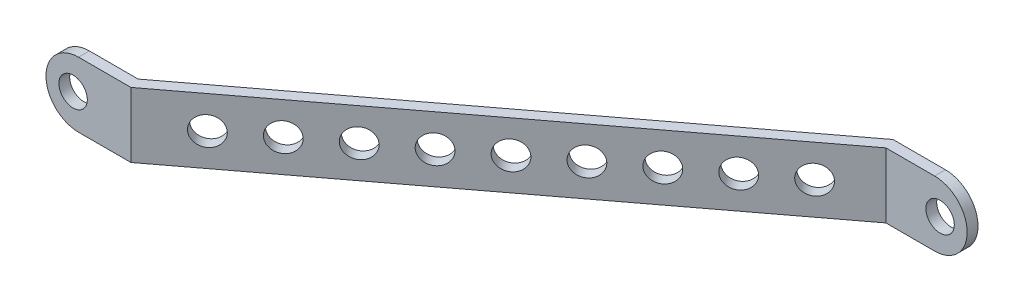
ISO-10303-21;
HEADER;
FILE_DESCRIPTION(('STEP AP214'),'2;1');
FILE_NAME('part.step','',(''),(''),'','','');
FILE_SCHEMA(('AUTOMOTIVE_DESIGN { 1 0 10303 214 1 1 1 1 }'));
ENDSEC;
DATA;
#1=APPLICATION_CONTEXT('core data for automotive mechanical design processes');
#2=APPLICATION_PROTOCOL_DEFINITION('international standard','automotive_design',2000,#1);
#3=PRODUCT_CONTEXT('',#1,'mechanical');
#4=PRODUCT('Part','Part','',(#3));
#5=PRODUCT_RELATED_PRODUCT_CATEGORY('part','',(#4));
#6=PRODUCT_DEFINITION_FORMATION('','',#4);
#7=PRODUCT_DEFINITION_CONTEXT('part definition',#1,'design');
#8=PRODUCT_DEFINITION('design','',#6,#7);
#9=PRODUCT_DEFINITION_SHAPE('','',#8);
#10=(LENGTH_UNIT() NAMED_UNIT(*) SI_UNIT(.MILLI.,.METRE.));
#11=(NAMED_UNIT(*) PLANE_ANGLE_UNIT() SI_UNIT($,.RADIAN.));
#12=(NAMED_UNIT(*) SI_UNIT($,.STERADIAN.) SOLID_ANGLE_UNIT());
#13=UNCERTAINTY_MEASURE_WITH_UNIT(LENGTH_MEASURE(1.E-05),#10,'distance_accuracy_value','');
#14=(GEOMETRIC_REPRESENTATION_CONTEXT(3) GLOBAL_UNCERTAINTY_ASSIGNED_CONTEXT((#13)) GLOBAL_UNIT_ASSIGNED_CONTEXT((#10,
#11,#12)) REPRESENTATION_CONTEXT('',''));
#15=CARTESIAN_POINT('',(0.,0.,0.));
#16=DIRECTION('',(0.,0.,1.));
#17=DIRECTION('',(1.,0.,0.));
#18=AXIS2_PLACEMENT_3D('',#15,#16,#17);
#19=CARTESIAN_POINT('',(-81.4365246825822,4.8,17.4471175497052));
#20=DIRECTION('',(0.,0.,-1.));
#21=DIRECTION('',(-1.,0.,0.));
#22=AXIS2_PLACEMENT_3D('',#19,#20,#21);
#23=CYLINDRICAL_SURFACE('',#22,4.8);
#24=CARTESIAN_POINT('',(-81.4365246825822,4.8,15.8471175497052));
#25=DIRECTION('',(0.,0.,-1.));
#26=DIRECTION('',(-1.,0.,0.));
#27=AXIS2_PLACEMENT_3D('',#24,#25,#26);
#28=CIRCLE('',#27,4.8);
#29=CARTESIAN_POINT('',(-81.4365246825822,9.6,15.8471175497052));
#30=VERTEX_POINT('',#29);
#31=CARTESIAN_POINT('',(-81.4365246825822,0.,15.8471175497052));
#32=VERTEX_POINT('',#31);
#33=EDGE_CURVE('E20',#30,#32,#28,.F.);
#34=ORIENTED_EDGE('',*,*,#33,.T.);
#35=DIRECTION('',(0.,0.,-1.));
#36=VECTOR('',#35,1.);
#37=CARTESIAN_POINT('',(-81.4365246825822,0.,15.8471175497052));
#38=LINE('',#37,#36);
#39=CARTESIAN_POINT('',(-81.4365246825822,0.,17.4471175497052));
#40=VERTEX_POINT('',#39);
#41=EDGE_CURVE('E112',#40,#32,#38,.T.);
#42=ORIENTED_EDGE('',*,*,#41,.F.);
#43=CARTESIAN_POINT('',(-81.4365246825822,4.8,17.4471175497052));
#44=DIRECTION('',(0.,0.,-1.));
#45=DIRECTION('',(-1.,0.,0.));
#46=AXIS2_PLACEMENT_3D('',#43,#44,#45);
#47=CIRCLE('',#46,4.8);
#48=CARTESIAN_POINT('',(-81.4365246825822,9.6,17.4471175497052));
#49=VERTEX_POINT('',#48);
#50=EDGE_CURVE('E84',#40,#49,#47,.T.);
#51=ORIENTED_EDGE('',*,*,#50,.T.);
#52=DIRECTION('',(0.,0.,-1.));
#53=VECTOR('',#52,1.);
#54=CARTESIAN_POINT('',(-81.4365246825822,9.6,17.4471175497052));
#55=LINE('',#54,#53);
#56=EDGE_CURVE('E80',#49,#30,#55,.T.);
#57=ORIENTED_EDGE('',*,*,#56,.T.);
#58=EDGE_LOOP('',(#34,#42,#51,#57));
#59=FACE_BOUND('',#58,.T.);
#60=ADVANCED_FACE('F17',(#59),#23,.T.);
#61=CARTESIAN_POINT('',(-82.2365246825822,4.8,7.84711754970517));
#62=DIRECTION('',(0.,0.,1.));
#63=DIRECTION('',(1.,0.,0.));
#64=AXIS2_PLACEMENT_3D('',#61,#62,#63);
#65=CYLINDRICAL_SURFACE('',#64,2.1);
#66=CARTESIAN_POINT('',(-82.2365246825822,4.8,15.8471175497052));
#67=DIRECTION('',(0.,0.,1.));
#68=DIRECTION('',(1.,0.,0.));
#69=AXIS2_PLACEMENT_3D('',#66,#67,#68);
#70=CIRCLE('',#69,2.1);
#71=CARTESIAN_POINT('',(-80.1365246825822,4.8,15.8471175497052));
#72=VERTEX_POINT('',#71);
#73=EDGE_CURVE('E96',#72,#72,#70,.F.);
#74=ORIENTED_EDGE('',*,*,#73,.T.);
#75=EDGE_LOOP('',(#74));
#76=FACE_BOUND('',#75,.T.);
#77=CARTESIAN_POINT('',(-82.2365246825822,4.8,17.4471175497052));
#78=DIRECTION('',(0.,0.,1.));
#79=DIRECTION('',(1.,0.,0.));
#80=AXIS2_PLACEMENT_3D('',#77,#78,#79);
#81=CIRCLE('',#80,2.1);
#82=CARTESIAN_POINT('',(-80.1365246825822,4.8,17.4471175497052));
#83=VERTEX_POINT('',#82);
#84=EDGE_CURVE('E102',#83,#83,#81,.T.);
#85=ORIENTED_EDGE('',*,*,#84,.T.);
#86=EDGE_LOOP('',(#85));
#87=FACE_BOUND('',#86,.T.);
#88=ADVANCED_FACE('F189',(#76,#87),#65,.F.);
#89=CARTESIAN_POINT('',(-86.2365246825823,9.6,15.8471175497052));
#90=DIRECTION('',(0.,0.,1.));
#91=DIRECTION('',(1.,0.,0.));
#92=AXIS2_PLACEMENT_3D('',#89,#90,#91);
#93=PLANE('',#92);
#94=ORIENTED_EDGE('',*,*,#73,.F.);
#95=EDGE_LOOP('',(#94));
#96=FACE_BOUND('',#95,.T.);
#97=DIRECTION('',(1.,0.,0.));
#98=VECTOR('',#97,1.);
#99=CARTESIAN_POINT('',(-86.2365246825823,9.6,15.8471175497052));
#100=LINE('',#99,#98);
#101=CARTESIAN_POINT('',(-74.2365246825822,9.6,15.8471175497052));
#102=VERTEX_POINT('',#101);
#103=EDGE_CURVE('E94',#30,#102,#100,.T.);
#104=ORIENTED_EDGE('',*,*,#103,.T.);
#105=DIRECTION('',(0.,1.,0.));
#106=VECTOR('',#105,1.);
#107=CARTESIAN_POINT('',(-74.2365246825822,9.6,15.8471175497052));
#108=LINE('',#107,#106);
#109=CARTESIAN_POINT('',(-74.2365246825822,0.,15.8471175497052));
#110=VERTEX_POINT('',#109);
#111=EDGE_CURVE('E110',#102,#110,#108,.F.);
#112=ORIENTED_EDGE('',*,*,#111,.T.);
#113=DIRECTION('',(1.,0.,0.));
#114=VECTOR('',#113,1.);
#115=CARTESIAN_POINT('',(-86.2365246825823,0.,15.8471175497052));
#116=LINE('',#115,#114);
#117=EDGE_CURVE('E95',#32,#110,#116,.T.);
#118=ORIENTED_EDGE('',*,*,#117,.F.);
#119=ORIENTED_EDGE('',*,*,#33,.F.);
#120=EDGE_LOOP('',(#104,#112,#118,#119));
#121=FACE_BOUND('',#120,.T.);
#122=ADVANCED_FACE('F92',(#96,#121),#93,.F.);
#123=CARTESIAN_POINT('',(-10.7734593192059,9.6,-32.1528824502948));
#124=DIRECTION('',(0.,0.,1.));
#125=DIRECTION('',(1.,0.,0.));
#126=AXIS2_PLACEMENT_3D('',#123,#124,#125);
#127=PLANE('',#126);
#128=CARTESIAN_POINT('',(-2.23652468258224,4.8,-32.1528824502948));
#129=DIRECTION('',(0.,0.,1.));
#130=DIRECTION('',(1.,0.,0.));
#131=AXIS2_PLACEMENT_3D('',#128,#129,#130);
#132=CIRCLE('',#131,2.1);
#133=CARTESIAN_POINT('',(-0.136524682582242,4.8,-32.1528824502948));
#134=VERTEX_POINT('',#133);
#135=EDGE_CURVE('E181',#134,#134,#132,.T.);
#136=ORIENTED_EDGE('',*,*,#135,.T.);
#137=EDGE_LOOP('',(#136));
#138=FACE_BOUND('',#137,.T.);
#139=DIRECTION('',(1.,0.,0.));
#140=VECTOR('',#139,1.);
#141=CARTESIAN_POINT('',(-86.2365246825823,0.,-32.1528824502948));
#142=LINE('',#141,#140);
#143=CARTESIAN_POINT('',(-10.7734593192059,0.,-32.1528824502948));
#144=VERTEX_POINT('',#143);
#145=CARTESIAN_POINT('',(-3.03652468258224,0.,-32.1528824502948));
#146=VERTEX_POINT('',#145);
#147=EDGE_CURVE('E115',#144,#146,#142,.T.);
#148=ORIENTED_EDGE('',*,*,#147,.F.);
#149=DIRECTION('',(0.,1.,0.));
#150=VECTOR('',#149,1.);
#151=CARTESIAN_POINT('',(-10.7734593192059,9.6,-32.1528824502948));
#152=LINE('',#151,#150);
#153=CARTESIAN_POINT('',(-10.7734593192059,9.6,-32.1528824502948));
#154=VERTEX_POINT('',#153);
#155=EDGE_CURVE('E184',#144,#154,#152,.T.);
#156=ORIENTED_EDGE('',*,*,#155,.T.);
#157=DIRECTION('',(1.,0.,0.));
#158=VECTOR('',#157,1.);
#159=CARTESIAN_POINT('',(-86.2365246825823,9.6,-32.1528824502948));
#160=LINE('',#159,#158);
#161=CARTESIAN_POINT('',(-3.03652468258224,9.6,-32.1528824502948));
#162=VERTEX_POINT('',#161);
#163=EDGE_CURVE('E104',#154,#162,#160,.T.);
#164=ORIENTED_EDGE('',*,*,#163,.T.);
#165=CARTESIAN_POINT('',(-3.03652468258223,4.8,-32.1528824502948));
#166=DIRECTION('',(0.,0.,-1.));
#167=DIRECTION('',(-1.,0.,0.));
#168=AXIS2_PLACEMENT_3D('',#165,#166,#167);
#169=CIRCLE('',#168,4.8);
#170=EDGE_CURVE('E185',#146,#162,#169,.F.);
#171=ORIENTED_EDGE('',*,*,#170,.F.);
#172=EDGE_LOOP('',(#148,#156,#164,#171));
#173=FACE_BOUND('',#172,.T.);
#174=ADVANCED_FACE('F193',(#138,#173),#127,.F.);
#175=CARTESIAN_POINT('',(-3.03652468258216,4.8,15.847117549705));
#176=DIRECTION('',(0.,0.,-1.));
#177=DIRECTION('',(-1.,0.,0.));
#178=AXIS2_PLACEMENT_3D('',#175,#176,#177);
#179=CYLINDRICAL_SURFACE('',#178,4.8);
#180=DIRECTION('',(0.,0.,-1.));
#181=VECTOR('',#180,1.);
#182=CARTESIAN_POINT('',(-3.03652468258224,0.,15.8471175497052));
#183=LINE('',#182,#181);
#184=CARTESIAN_POINT('',(-3.03652468258224,0.,-30.5528824502948));
#185=VERTEX_POINT('',#184);
#186=EDGE_CURVE('E117',#146,#185,#183,.F.);
#187=ORIENTED_EDGE('',*,*,#186,.F.);
#188=ORIENTED_EDGE('',*,*,#170,.T.);
#189=DIRECTION('',(0.,0.,-1.));
#190=VECTOR('',#189,1.);
#191=CARTESIAN_POINT('',(-3.03652468258224,9.6,15.8471175497052));
#192=LINE('',#191,#190);
#193=CARTESIAN_POINT('',(-3.03652468258224,9.6,-30.5528824502948));
#194=VERTEX_POINT('',#193);
#195=EDGE_CURVE('E292',#162,#194,#192,.F.);
#196=ORIENTED_EDGE('',*,*,#195,.T.);
#197=CARTESIAN_POINT('',(-3.03652468258223,4.8,-30.5528824502948));
#198=DIRECTION('',(0.,0.,-1.));
#199=DIRECTION('',(-1.,0.,0.));
#200=AXIS2_PLACEMENT_3D('',#197,#198,#199);
#201=CIRCLE('',#200,4.8);
#202=EDGE_CURVE('E168',#194,#185,#201,.T.);
#203=ORIENTED_EDGE('',*,*,#202,.T.);
#204=EDGE_LOOP('',(#187,#188,#196,#203));
#205=FACE_BOUND('',#204,.T.);
#206=ADVANCED_FACE('F200',(#205),#179,.T.);
#207=CARTESIAN_POINT('',(-2.23652468258224,4.8,-40.1528824502948));
#208=DIRECTION('',(0.,0.,1.));
#209=DIRECTION('',(1.,0.,0.));
#210=AXIS2_PLACEMENT_3D('',#207,#208,#209);
#211=CYLINDRICAL_SURFACE('',#210,2.1);
#212=ORIENTED_EDGE('',*,*,#135,.F.);
#213=EDGE_LOOP('',(#212));
#214=FACE_BOUND('',#213,.T.);
#215=CARTESIAN_POINT('',(-2.23652468258224,4.8,-30.5528824502948));
#216=DIRECTION('',(0.,0.,1.));
#217=DIRECTION('',(1.,0.,0.));
#218=AXIS2_PLACEMENT_3D('',#215,#216,#217);
#219=CIRCLE('',#218,2.1);
#220=CARTESIAN_POINT('',(-0.136524682582242,4.8,-30.5528824502948));
#221=VERTEX_POINT('',#220);
#222=EDGE_CURVE('E165',#221,#221,#219,.T.);
#223=ORIENTED_EDGE('',*,*,#222,.T.);
#224=EDGE_LOOP('',(#223));
#225=FACE_BOUND('',#224,.T.);
#226=ADVANCED_FACE('F265',(#214,#225),#211,.F.);
#227=CARTESIAN_POINT('',(-74.2365246825822,9.6,15.8471175497052));
#228=DIRECTION('',(0.603234054930972,0.,0.797564213697892));
#229=DIRECTION('',(0.797564213697892,0.,-0.603234054930972));
#230=AXIS2_PLACEMENT_3D('',#227,#228,#229);
#231=PLANE('',#230);
#232=CARTESIAN_POINT('',(-68.2363969714431,4.8,11.3089483250449));
#233=DIRECTION('',(0.603234054930972,0.,0.797564213697892));
#234=DIRECTION('',(0.797564213697892,0.,-0.603234054930972));
#235=AXIS2_PLACEMENT_3D('',#232,#233,#234);
#236=CIRCLE('',#235,2.1);
#237=CARTESIAN_POINT('',(-66.5615121226776,4.8,10.0421568096899));
#238=VERTEX_POINT('',#237);
#239=EDGE_CURVE('E147',#238,#238,#236,.T.);
#240=ORIENTED_EDGE('',*,*,#239,.T.);
#241=EDGE_LOOP('',(#240));
#242=FACE_BOUND('',#241,.T.);
#243=CARTESIAN_POINT('',(-61.85588326186,4.8,6.48307588559712));
#244=DIRECTION('',(0.603234054930972,0.,0.797564213697892));
#245=DIRECTION('',(0.797564213697892,0.,-0.603234054930972));
#246=AXIS2_PLACEMENT_3D('',#243,#244,#245);
#247=CIRCLE('',#246,2.1);
#248=CARTESIAN_POINT('',(-60.1809984130944,4.8,5.21628437024208));
#249=VERTEX_POINT('',#248);
#250=EDGE_CURVE('E150',#249,#249,#247,.T.);
#251=ORIENTED_EDGE('',*,*,#250,.T.);
#252=EDGE_LOOP('',(#251));
#253=FACE_BOUND('',#252,.T.);
#254=CARTESIAN_POINT('',(-55.4753695522769,4.8,1.65720344614935));
#255=DIRECTION('',(0.603234054930972,0.,0.797564213697892));
#256=DIRECTION('',(0.797564213697892,0.,-0.603234054930972));
#257=AXIS2_PLACEMENT_3D('',#254,#255,#256);
#258=CIRCLE('',#257,2.1);
#259=CARTESIAN_POINT('',(-53.8004847035113,4.8,0.390411930794314));
#260=VERTEX_POINT('',#259);
#261=EDGE_CURVE('E153',#260,#260,#258,.T.);
#262=ORIENTED_EDGE('',*,*,#261,.T.);
#263=EDGE_LOOP('',(#262));
#264=FACE_BOUND('',#263,.T.);
#265=CARTESIAN_POINT('',(-49.0948558426937,4.8,-3.16866899329842));
#266=DIRECTION('',(0.603234054930972,0.,0.797564213697892));
#267=DIRECTION('',(0.797564213697892,0.,-0.603234054930972));
#268=AXIS2_PLACEMENT_3D('',#265,#266,#267);
#269=CIRCLE('',#268,2.1);
#270=CARTESIAN_POINT('',(-47.4199709939281,4.8,-4.43546050865347));
#271=VERTEX_POINT('',#270);
#272=EDGE_CURVE('E156',#271,#271,#269,.T.);
#273=ORIENTED_EDGE('',*,*,#272,.T.);
#274=EDGE_LOOP('',(#273));
#275=FACE_BOUND('',#274,.T.);
#276=CARTESIAN_POINT('',(-36.3338284235274,4.8,-12.820413872194));
#277=DIRECTION('',(0.603234054930972,0.,0.797564213697892));
#278=DIRECTION('',(0.797564213697892,0.,-0.603234054930972));
#279=AXIS2_PLACEMENT_3D('',#276,#277,#278);
#280=CIRCLE('',#279,2.1);
#281=CARTESIAN_POINT('',(-34.6589435747619,4.8,-14.087205387549));
#282=VERTEX_POINT('',#281);
#283=EDGE_CURVE('E159',#282,#282,#280,.T.);
#284=ORIENTED_EDGE('',*,*,#283,.T.);
#285=EDGE_LOOP('',(#284));
#286=FACE_BOUND('',#285,.T.);
#287=CARTESIAN_POINT('',(-42.7143421331106,4.8,-7.9945414327462));
#288=DIRECTION('',(0.603234054930972,0.,0.797564213697892));
#289=DIRECTION('',(0.797564213697892,0.,-0.603234054930972));
#290=AXIS2_PLACEMENT_3D('',#287,#288,#289);
#291=CIRCLE('',#290,2.1);
#292=CARTESIAN_POINT('',(-41.039457284345,4.8,-9.26133294810124));
#293=VERTEX_POINT('',#292);
#294=EDGE_CURVE('E162',#293,#293,#291,.T.);
#295=ORIENTED_EDGE('',*,*,#294,.T.);
#296=EDGE_LOOP('',(#295));
#297=FACE_BOUND('',#296,.T.);
#298=DIRECTION('',(0.797564213697892,0.,-0.603234054930972));
#299=VECTOR('',#298,1.);
#300=CARTESIAN_POINT('',(-74.2365246825822,9.6,15.8471175497052));
#301=LINE('',#300,#299);
#302=EDGE_CURVE('E101',#102,#154,#301,.T.);
#303=ORIENTED_EDGE('',*,*,#302,.T.);
#304=ORIENTED_EDGE('',*,*,#155,.F.);
#305=DIRECTION('',(0.797564213697892,0.,-0.603234054930972));
#306=VECTOR('',#305,1.);
#307=CARTESIAN_POINT('',(-74.2365246825822,0.,15.8471175497052));
#308=LINE('',#307,#306);
#309=EDGE_CURVE('E118',#110,#144,#308,.T.);
#310=ORIENTED_EDGE('',*,*,#309,.F.);
#311=ORIENTED_EDGE('',*,*,#111,.F.);
#312=EDGE_LOOP('',(#303,#304,#310,#311));
#313=FACE_BOUND('',#312,.T.);
#314=CARTESIAN_POINT('',(-29.9533147139443,4.8,-17.6462863116417));
#315=DIRECTION('',(0.603234054930972,0.,0.797564213697892));
#316=DIRECTION('',(0.797564213697892,0.,-0.603234054930972));
#317=AXIS2_PLACEMENT_3D('',#314,#315,#316);
#318=CIRCLE('',#317,2.1);
#319=CARTESIAN_POINT('',(-28.2784298651787,4.8,-18.9130778269968));
#320=VERTEX_POINT('',#319);
#321=EDGE_CURVE('E113',#320,#320,#318,.T.);
#322=ORIENTED_EDGE('',*,*,#321,.T.);
#323=EDGE_LOOP('',(#322));
#324=FACE_BOUND('',#323,.T.);
#325=CARTESIAN_POINT('',(-23.5728010043612,4.8,-22.4721587510895));
#326=DIRECTION('',(0.603234054930972,0.,0.797564213697892));
#327=DIRECTION('',(0.797564213697892,0.,-0.603234054930972));
#328=AXIS2_PLACEMENT_3D('',#325,#326,#327);
#329=CIRCLE('',#328,2.1);
#330=CARTESIAN_POINT('',(-21.8979161555956,4.8,-23.7389502664446));
#331=VERTEX_POINT('',#330);
#332=EDGE_CURVE('E175',#331,#331,#329,.T.);
#333=ORIENTED_EDGE('',*,*,#332,.T.);
#334=EDGE_LOOP('',(#333));
#335=FACE_BOUND('',#334,.T.);
#336=CARTESIAN_POINT('',(-17.192287294778,4.8,-27.2980311905373));
#337=DIRECTION('',(0.603234054930972,0.,0.797564213697892));
#338=DIRECTION('',(0.797564213697892,0.,-0.603234054930972));
#339=AXIS2_PLACEMENT_3D('',#336,#337,#338);
#340=CIRCLE('',#339,2.1);
#341=CARTESIAN_POINT('',(-15.5174024460124,4.8,-28.5648227058923));
#342=VERTEX_POINT('',#341);
#343=EDGE_CURVE('E178',#342,#342,#340,.T.);
#344=ORIENTED_EDGE('',*,*,#343,.T.);
#345=EDGE_LOOP('',(#344));
#346=FACE_BOUND('',#345,.T.);
#347=ADVANCED_FACE('F261',(#242,#253,#264,#275,#286,#297,#313,#324,#335,#346),#231,.F.);
#348=CARTESIAN_POINT('',(-22.0181597342258,4.8,-33.6785449001204));
#349=DIRECTION('',(0.603234054930972,0.,0.797564213697892));
#350=DIRECTION('',(0.797564213697892,0.,-0.603234054930972));
#351=AXIS2_PLACEMENT_3D('',#348,#349,#350);
#352=CYLINDRICAL_SURFACE('',#351,2.1);
#353=CARTESIAN_POINT('',(-16.2271128068885,4.8,-26.0219284486207));
#354=DIRECTION('',(0.603234054930972,0.,0.797564213697892));
#355=DIRECTION('',(0.797564213697892,0.,-0.603234054930972));
#356=AXIS2_PLACEMENT_3D('',#353,#354,#355);
#357=CIRCLE('',#356,2.1);
#358=CARTESIAN_POINT('',(-14.5522279581229,4.8,-27.2887199639757));
#359=VERTEX_POINT('',#358);
#360=EDGE_CURVE('E144',#359,#359,#357,.T.);
#361=ORIENTED_EDGE('',*,*,#360,.T.);
#362=EDGE_LOOP('',(#361));
#363=FACE_BOUND('',#362,.T.);
#364=ORIENTED_EDGE('',*,*,#343,.F.);
#365=EDGE_LOOP('',(#364));
#366=FACE_BOUND('',#365,.T.);
#367=ADVANCED_FACE('F257',(#363,#366),#352,.F.);
#368=CARTESIAN_POINT('',(-28.3986734438089,4.8,-28.8526724606727));
#369=DIRECTION('',(0.603234054930972,0.,0.797564213697892));
#370=DIRECTION('',(0.797564213697892,0.,-0.603234054930972));
#371=AXIS2_PLACEMENT_3D('',#368,#369,#370);
#372=CYLINDRICAL_SURFACE('',#371,2.1);
#373=CARTESIAN_POINT('',(-22.6076265164716,4.8,-21.1960560091729));
#374=DIRECTION('',(0.603234054930972,0.,0.797564213697892));
#375=DIRECTION('',(0.797564213697892,0.,-0.603234054930972));
#376=AXIS2_PLACEMENT_3D('',#373,#374,#375);
#377=CIRCLE('',#376,2.1);
#378=CARTESIAN_POINT('',(-20.932741667706,4.8,-22.4628475245279));
#379=VERTEX_POINT('',#378);
#380=EDGE_CURVE('E141',#379,#379,#377,.T.);
#381=ORIENTED_EDGE('',*,*,#380,.T.);
#382=EDGE_LOOP('',(#381));
#383=FACE_BOUND('',#382,.T.);
#384=ORIENTED_EDGE('',*,*,#332,.F.);
#385=EDGE_LOOP('',(#384));
#386=FACE_BOUND('',#385,.T.);
#387=ADVANCED_FACE('F253',(#383,#386),#372,.F.);
#388=CARTESIAN_POINT('',(-34.7791871533921,4.8,-24.0268000212249));
#389=DIRECTION('',(0.603234054930972,0.,0.797564213697892));
#390=DIRECTION('',(0.797564213697892,0.,-0.603234054930972));
#391=AXIS2_PLACEMENT_3D('',#388,#389,#390);
#392=CYLINDRICAL_SURFACE('',#391,2.1);
#393=CARTESIAN_POINT('',(-28.9881402260547,4.8,-16.3701835697251));
#394=DIRECTION('',(0.603234054930972,0.,0.797564213697892));
#395=DIRECTION('',(0.797564213697892,0.,-0.603234054930972));
#396=AXIS2_PLACEMENT_3D('',#393,#394,#395);
#397=CIRCLE('',#396,2.1);
#398=CARTESIAN_POINT('',(-27.3132553772892,4.8,-17.6369750850802));
#399=VERTEX_POINT('',#398);
#400=EDGE_CURVE('E137',#399,#399,#397,.T.);
#401=ORIENTED_EDGE('',*,*,#400,.T.);
#402=EDGE_LOOP('',(#401));
#403=FACE_BOUND('',#402,.T.);
#404=ORIENTED_EDGE('',*,*,#321,.F.);
#405=EDGE_LOOP('',(#404));
#406=FACE_BOUND('',#405,.T.);
#407=ADVANCED_FACE('F249',(#403,#406),#392,.F.);
#408=CARTESIAN_POINT('',(-86.2365246825823,0.,15.8471175497052));
#409=DIRECTION('',(0.,-1.,0.));
#410=DIRECTION('',(0.,0.,-1.));
#411=AXIS2_PLACEMENT_3D('',#408,#409,#410);
#412=PLANE('',#411);
#413=ORIENTED_EDGE('',*,*,#147,.T.);
#414=ORIENTED_EDGE('',*,*,#186,.T.);
#415=DIRECTION('',(-1.,0.,0.));
#416=VECTOR('',#415,1.);
#417=CARTESIAN_POINT('',(1.76347531741776,0.,-30.5528824502948));
#418=LINE('',#417,#416);
#419=CARTESIAN_POINT('',(-10.2365246825822,0.,-30.5528824502948));
#420=VERTEX_POINT('',#419);
#421=EDGE_CURVE('E291',#185,#420,#418,.T.);
#422=ORIENTED_EDGE('',*,*,#421,.T.);
#423=DIRECTION('',(-0.797564213697892,0.,0.603234054930972));
#424=VECTOR('',#423,1.);
#425=CARTESIAN_POINT('',(-10.2365246825822,0.,-30.5528824502948));
#426=LINE('',#425,#424);
#427=CARTESIAN_POINT('',(-73.6995900459586,0.,17.4471175497052));
#428=VERTEX_POINT('',#427);
#429=EDGE_CURVE('E140',#420,#428,#426,.T.);
#430=ORIENTED_EDGE('',*,*,#429,.T.);
#431=DIRECTION('',(-1.,0.,0.));
#432=VECTOR('',#431,1.);
#433=CARTESIAN_POINT('',(-73.6995900459586,0.,17.4471175497052));
#434=LINE('',#433,#432);
#435=EDGE_CURVE('E172',#428,#40,#434,.T.);
#436=ORIENTED_EDGE('',*,*,#435,.T.);
#437=ORIENTED_EDGE('',*,*,#41,.T.);
#438=ORIENTED_EDGE('',*,*,#117,.T.);
#439=ORIENTED_EDGE('',*,*,#309,.T.);
#440=EDGE_LOOP('',(#413,#414,#422,#430,#436,#437,#438,#439));
#441=FACE_BOUND('',#440,.T.);
#442=ADVANCED_FACE('F245',(#441),#412,.T.);
#443=CARTESIAN_POINT('',(-73.6995900459586,9.6,17.4471175497052));
#444=DIRECTION('',(0.,0.,-1.));
#445=DIRECTION('',(-1.,0.,0.));
#446=AXIS2_PLACEMENT_3D('',#443,#444,#445);
#447=PLANE('',#446);
#448=ORIENTED_EDGE('',*,*,#84,.F.);
#449=EDGE_LOOP('',(#448));
#450=FACE_BOUND('',#449,.T.);
#451=ORIENTED_EDGE('',*,*,#435,.F.);
#452=DIRECTION('',(0.,1.,0.));
#453=VECTOR('',#452,1.);
#454=CARTESIAN_POINT('',(-73.6995900459586,9.6,17.4471175497052));
#455=LINE('',#454,#453);
#456=CARTESIAN_POINT('',(-73.6995900459586,9.6,17.4471175497052));
#457=VERTEX_POINT('',#456);
#458=EDGE_CURVE('E288',#428,#457,#455,.T.);
#459=ORIENTED_EDGE('',*,*,#458,.T.);
#460=DIRECTION('',(1.,0.,0.));
#461=VECTOR('',#460,1.);
#462=CARTESIAN_POINT('',(-86.2365246825823,9.6,17.4471175497052));
#463=LINE('',#462,#461);
#464=EDGE_CURVE('E289',#457,#49,#463,.F.);
#465=ORIENTED_EDGE('',*,*,#464,.T.);
#466=ORIENTED_EDGE('',*,*,#50,.F.);
#467=EDGE_LOOP('',(#451,#459,#465,#466));
#468=FACE_BOUND('',#467,.T.);
#469=ADVANCED_FACE('F242',(#450,#468),#447,.F.);
#470=CARTESIAN_POINT('',(-86.2365246825823,9.6,15.8471175497052));
#471=DIRECTION('',(0.,-1.,0.));
#472=DIRECTION('',(0.,0.,-1.));
#473=AXIS2_PLACEMENT_3D('',#470,#471,#472);
#474=PLANE('',#473);
#475=ORIENTED_EDGE('',*,*,#464,.F.);
#476=DIRECTION('',(-0.797564213697892,0.,0.603234054930972));
#477=VECTOR('',#476,1.);
#478=CARTESIAN_POINT('',(-10.2365246825822,9.6,-30.5528824502948));
#479=LINE('',#478,#477);
#480=CARTESIAN_POINT('',(-10.2365246825822,9.6,-30.5528824502948));
#481=VERTEX_POINT('',#480);
#482=EDGE_CURVE('E284',#457,#481,#479,.F.);
#483=ORIENTED_EDGE('',*,*,#482,.T.);
#484=DIRECTION('',(-1.,0.,0.));
#485=VECTOR('',#484,1.);
#486=CARTESIAN_POINT('',(1.76347531741776,9.6,-30.5528824502948));
#487=LINE('',#486,#485);
#488=EDGE_CURVE('E35',#481,#194,#487,.F.);
#489=ORIENTED_EDGE('',*,*,#488,.T.);
#490=ORIENTED_EDGE('',*,*,#195,.F.);
#491=ORIENTED_EDGE('',*,*,#163,.F.);
#492=ORIENTED_EDGE('',*,*,#302,.F.);
#493=ORIENTED_EDGE('',*,*,#103,.F.);
#494=ORIENTED_EDGE('',*,*,#56,.F.);
#495=EDGE_LOOP('',(#475,#483,#489,#490,#491,#492,#493,#494));
#496=FACE_BOUND('',#495,.T.);
#497=ADVANCED_FACE('F98',(#496),#474,.F.);
#498=CARTESIAN_POINT('',(1.76347531741776,9.6,-30.5528824502948));
#499=DIRECTION('',(0.,0.,-1.));
#500=DIRECTION('',(-1.,0.,0.));
#501=AXIS2_PLACEMENT_3D('',#498,#499,#500);
#502=PLANE('',#501);
#503=ORIENTED_EDGE('',*,*,#222,.F.);
#504=EDGE_LOOP('',(#503));
#505=FACE_BOUND('',#504,.T.);
#506=ORIENTED_EDGE('',*,*,#488,.F.);
#507=DIRECTION('',(0.,1.,0.));
#508=VECTOR('',#507,1.);
#509=CARTESIAN_POINT('',(-10.2365246825822,9.6,-30.5528824502948));
#510=LINE('',#509,#508);
#511=EDGE_CURVE('E136',#481,#420,#510,.F.);
#512=ORIENTED_EDGE('',*,*,#511,.T.);
#513=ORIENTED_EDGE('',*,*,#421,.F.);
#514=ORIENTED_EDGE('',*,*,#202,.F.);
#515=EDGE_LOOP('',(#506,#512,#513,#514));
#516=FACE_BOUND('',#515,.T.);
#517=ADVANCED_FACE('F235',(#505,#516),#502,.F.);
#518=CARTESIAN_POINT('',(-47.5402145725584,4.8,-14.3750551423293));
#519=DIRECTION('',(0.603234054930972,0.,0.797564213697892));
#520=DIRECTION('',(0.797564213697892,0.,-0.603234054930972));
#521=AXIS2_PLACEMENT_3D('',#518,#519,#520);
#522=CYLINDRICAL_SURFACE('',#521,2.1);
#523=CARTESIAN_POINT('',(-41.749167645221,4.8,-6.71843869082956));
#524=DIRECTION('',(0.603234054930972,0.,0.797564213697892));
#525=DIRECTION('',(0.797564213697892,0.,-0.603234054930972));
#526=AXIS2_PLACEMENT_3D('',#523,#524,#525);
#527=CIRCLE('',#526,2.1);
#528=CARTESIAN_POINT('',(-40.0742827964555,4.8,-7.9852302061846));
#529=VERTEX_POINT('',#528);
#530=EDGE_CURVE('E133',#529,#529,#527,.T.);
#531=ORIENTED_EDGE('',*,*,#530,.T.);
#532=EDGE_LOOP('',(#531));
#533=FACE_BOUND('',#532,.T.);
#534=ORIENTED_EDGE('',*,*,#294,.F.);
#535=EDGE_LOOP('',(#534));
#536=FACE_BOUND('',#535,.T.);
#537=ADVANCED_FACE('F231',(#533,#536),#522,.F.);
#538=CARTESIAN_POINT('',(-41.1597008629752,4.8,-19.2009275817771));
#539=DIRECTION('',(0.603234054930972,0.,0.797564213697892));
#540=DIRECTION('',(0.797564213697892,0.,-0.603234054930972));
#541=AXIS2_PLACEMENT_3D('',#538,#539,#540);
#542=CYLINDRICAL_SURFACE('',#541,2.1);
#543=CARTESIAN_POINT('',(-35.3686539356379,4.8,-11.5443111302773));
#544=DIRECTION('',(0.603234054930972,0.,0.797564213697892));
#545=DIRECTION('',(0.797564213697892,0.,-0.603234054930972));
#546=AXIS2_PLACEMENT_3D('',#543,#544,#545);
#547=CIRCLE('',#546,2.1);
#548=CARTESIAN_POINT('',(-33.6937690868723,4.8,-12.8111026456324));
#549=VERTEX_POINT('',#548);
#550=EDGE_CURVE('E130',#549,#549,#547,.T.);
#551=ORIENTED_EDGE('',*,*,#550,.T.);
#552=EDGE_LOOP('',(#551));
#553=FACE_BOUND('',#552,.T.);
#554=ORIENTED_EDGE('',*,*,#283,.F.);
#555=EDGE_LOOP('',(#554));
#556=FACE_BOUND('',#555,.T.);
#557=ADVANCED_FACE('F227',(#553,#556),#542,.F.);
#558=CARTESIAN_POINT('',(-53.9207282821415,4.8,-9.54918270288156));
#559=DIRECTION('',(0.603234054930972,0.,0.797564213697892));
#560=DIRECTION('',(0.797564213697892,0.,-0.603234054930972));
#561=AXIS2_PLACEMENT_3D('',#558,#559,#560);
#562=CYLINDRICAL_SURFACE('',#561,2.1);
#563=CARTESIAN_POINT('',(-48.1296813548041,4.8,-1.89256625138179));
#564=DIRECTION('',(0.603234054930972,0.,0.797564213697892));
#565=DIRECTION('',(0.797564213697892,0.,-0.603234054930972));
#566=AXIS2_PLACEMENT_3D('',#563,#564,#565);
#567=CIRCLE('',#566,2.1);
#568=CARTESIAN_POINT('',(-46.4547965060386,4.8,-3.15935776673683));
#569=VERTEX_POINT('',#568);
#570=EDGE_CURVE('E127',#569,#569,#567,.T.);
#571=ORIENTED_EDGE('',*,*,#570,.T.);
#572=EDGE_LOOP('',(#571));
#573=FACE_BOUND('',#572,.T.);
#574=ORIENTED_EDGE('',*,*,#272,.F.);
#575=EDGE_LOOP('',(#574));
#576=FACE_BOUND('',#575,.T.);
#577=ADVANCED_FACE('F223',(#573,#576),#562,.F.);
#578=CARTESIAN_POINT('',(-60.3012419917246,4.8,-4.72331026343378));
#579=DIRECTION('',(0.603234054930972,0.,0.797564213697892));
#580=DIRECTION('',(0.797564213697892,0.,-0.603234054930972));
#581=AXIS2_PLACEMENT_3D('',#578,#579,#580);
#582=CYLINDRICAL_SURFACE('',#581,2.1);
#583=CARTESIAN_POINT('',(-54.5101950643873,4.8,2.93330618806599));
#584=DIRECTION('',(0.603234054930972,0.,0.797564213697892));
#585=DIRECTION('',(0.797564213697892,0.,-0.603234054930972));
#586=AXIS2_PLACEMENT_3D('',#583,#584,#585);
#587=CIRCLE('',#586,2.1);
#588=CARTESIAN_POINT('',(-52.8353102156217,4.8,1.66651467271095));
#589=VERTEX_POINT('',#588);
#590=EDGE_CURVE('E124',#589,#589,#587,.T.);
#591=ORIENTED_EDGE('',*,*,#590,.T.);
#592=EDGE_LOOP('',(#591));
#593=FACE_BOUND('',#592,.T.);
#594=ORIENTED_EDGE('',*,*,#261,.F.);
#595=EDGE_LOOP('',(#594));
#596=FACE_BOUND('',#595,.T.);
#597=ADVANCED_FACE('F219',(#593,#596),#582,.F.);
#598=CARTESIAN_POINT('',(-66.6817557013078,4.8,0.102562176013999));
#599=DIRECTION('',(0.603234054930972,0.,0.797564213697892));
#600=DIRECTION('',(0.797564213697892,0.,-0.603234054930972));
#601=AXIS2_PLACEMENT_3D('',#598,#599,#600);
#602=CYLINDRICAL_SURFACE('',#601,2.1);
#603=CARTESIAN_POINT('',(-60.8907087739704,4.8,7.75917862751376));
#604=DIRECTION('',(0.603234054930972,0.,0.797564213697892));
#605=DIRECTION('',(0.797564213697892,0.,-0.603234054930972));
#606=AXIS2_PLACEMENT_3D('',#603,#604,#605);
#607=CIRCLE('',#606,2.1);
#608=CARTESIAN_POINT('',(-59.2158239252049,4.8,6.49238711215872));
#609=VERTEX_POINT('',#608);
#610=EDGE_CURVE('E26',#609,#609,#607,.T.);
#611=ORIENTED_EDGE('',*,*,#610,.T.);
#612=EDGE_LOOP('',(#611));
#613=FACE_BOUND('',#612,.T.);
#614=ORIENTED_EDGE('',*,*,#250,.F.);
#615=EDGE_LOOP('',(#614));
#616=FACE_BOUND('',#615,.T.);
#617=ADVANCED_FACE('F211',(#613,#616),#602,.F.);
#618=CARTESIAN_POINT('',(-73.0622694108909,4.8,4.92843461546177));
#619=DIRECTION('',(0.603234054930972,0.,0.797564213697892));
#620=DIRECTION('',(0.797564213697892,0.,-0.603234054930972));
#621=AXIS2_PLACEMENT_3D('',#618,#619,#620);
#622=CYLINDRICAL_SURFACE('',#621,2.1);
#623=CARTESIAN_POINT('',(-67.2712224835536,4.8,12.5850510669615));
#624=DIRECTION('',(0.603234054930972,0.,0.797564213697892));
#625=DIRECTION('',(0.797564213697892,0.,-0.603234054930972));
#626=AXIS2_PLACEMENT_3D('',#623,#624,#625);
#627=CIRCLE('',#626,2.1);
#628=CARTESIAN_POINT('',(-65.596337634788,4.8,11.3182595516065));
#629=VERTEX_POINT('',#628);
#630=EDGE_CURVE('E10',#629,#629,#627,.T.);
#631=ORIENTED_EDGE('',*,*,#630,.T.);
#632=EDGE_LOOP('',(#631));
#633=FACE_BOUND('',#632,.T.);
#634=ORIENTED_EDGE('',*,*,#239,.F.);
#635=EDGE_LOOP('',(#634));
#636=FACE_BOUND('',#635,.T.);
#637=ADVANCED_FACE('F205',(#633,#636),#622,.F.);
#638=CARTESIAN_POINT('',(-10.2365246825822,9.6,-30.5528824502948));
#639=DIRECTION('',(-0.603234054930972,0.,-0.797564213697892));
#640=DIRECTION('',(-0.797564213697892,0.,0.603234054930972));
#641=AXIS2_PLACEMENT_3D('',#638,#639,#640);
#642=PLANE('',#641);
#643=ORIENTED_EDGE('',*,*,#630,.F.);
#644=EDGE_LOOP('',(#643));
#645=FACE_BOUND('',#644,.T.);
#646=ORIENTED_EDGE('',*,*,#610,.F.);
#647=EDGE_LOOP('',(#646));
#648=FACE_BOUND('',#647,.T.);
#649=ORIENTED_EDGE('',*,*,#590,.F.);
#650=EDGE_LOOP('',(#649));
#651=FACE_BOUND('',#650,.T.);
#652=ORIENTED_EDGE('',*,*,#570,.F.);
#653=EDGE_LOOP('',(#652));
#654=FACE_BOUND('',#653,.T.);
#655=ORIENTED_EDGE('',*,*,#550,.F.);
#656=EDGE_LOOP('',(#655));
#657=FACE_BOUND('',#656,.T.);
#658=ORIENTED_EDGE('',*,*,#530,.F.);
#659=EDGE_LOOP('',(#658));
#660=FACE_BOUND('',#659,.T.);
#661=ORIENTED_EDGE('',*,*,#482,.F.);
#662=ORIENTED_EDGE('',*,*,#458,.F.);
#663=ORIENTED_EDGE('',*,*,#429,.F.);
#664=ORIENTED_EDGE('',*,*,#511,.F.);
#665=EDGE_LOOP('',(#661,#662,#663,#664));
#666=FACE_BOUND('',#665,.T.);
#667=ORIENTED_EDGE('',*,*,#400,.F.);
#668=EDGE_LOOP('',(#667));
#669=FACE_BOUND('',#668,.T.);
#670=ORIENTED_EDGE('',*,*,#380,.F.);
#671=EDGE_LOOP('',(#670));
#672=FACE_BOUND('',#671,.T.);
#673=ORIENTED_EDGE('',*,*,#360,.F.);
#674=EDGE_LOOP('',(#673));
#675=FACE_BOUND('',#674,.T.);
#676=ADVANCED_FACE('F203',(#645,#648,#651,#654,#657,#660,#666,#669,#672,#675),#642,.F.);
#677=CLOSED_SHELL('',(#60,#88,#122,#174,#206,#226,#347,#367,#387,#407,#442,#469,#497,#517,#537,
#557,#577,#597,#617,#637,#676));
#678=MANIFOLD_SOLID_BREP('B1',#677);
#679=ADVANCED_BREP_SHAPE_REPRESENTATION('',(#18,#678),#14);
#680=SHAPE_DEFINITION_REPRESENTATION(#9,#679);
ENDSEC;
END-ISO-10303-21;
